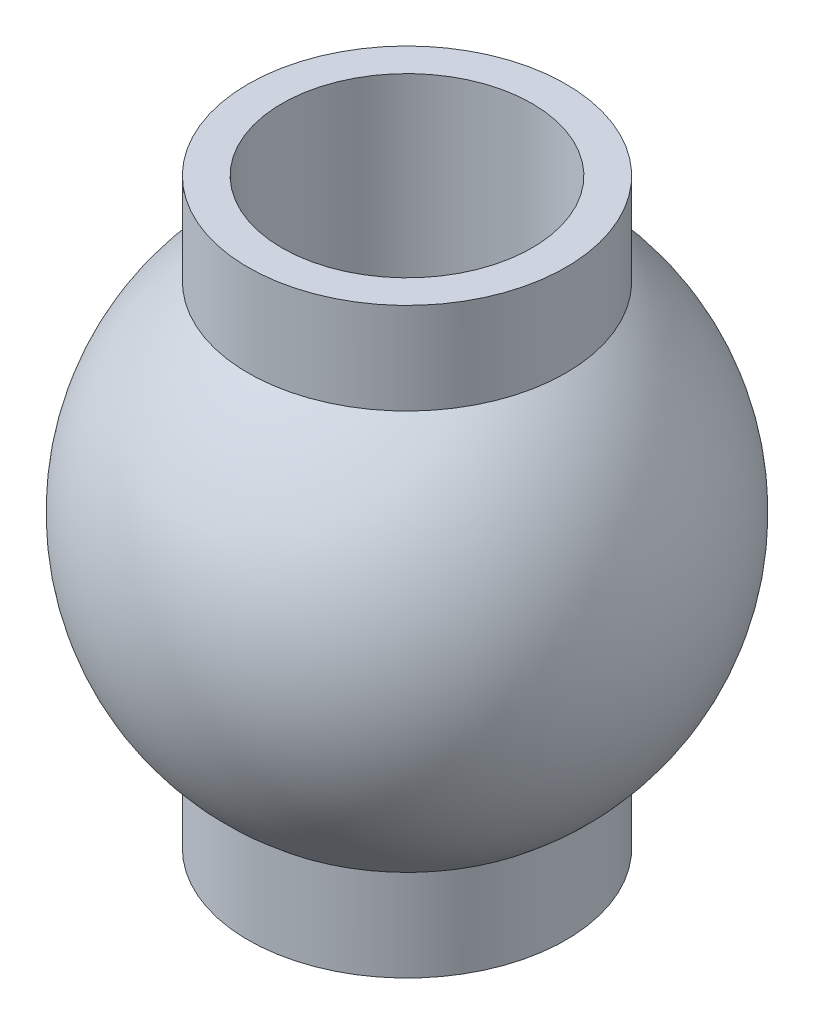
ISO-10303-21;
HEADER;
FILE_DESCRIPTION(('STEP AP214'),'2;1');
FILE_NAME('part.step','',(''),(''),'','','');
FILE_SCHEMA(('AUTOMOTIVE_DESIGN { 1 0 10303 214 1 1 1 1 }'));
ENDSEC;
DATA;
#1=APPLICATION_CONTEXT('core data for automotive mechanical design processes');
#2=APPLICATION_PROTOCOL_DEFINITION('international standard','automotive_design',2000,#1);
#3=PRODUCT_CONTEXT('',#1,'mechanical');
#4=PRODUCT('Part','Part','',(#3));
#5=PRODUCT_RELATED_PRODUCT_CATEGORY('part','',(#4));
#6=PRODUCT_DEFINITION_FORMATION('','',#4);
#7=PRODUCT_DEFINITION_CONTEXT('part definition',#1,'design');
#8=PRODUCT_DEFINITION('design','',#6,#7);
#9=PRODUCT_DEFINITION_SHAPE('','',#8);
#10=(LENGTH_UNIT() NAMED_UNIT(*) SI_UNIT(.MILLI.,.METRE.));
#11=(NAMED_UNIT(*) PLANE_ANGLE_UNIT() SI_UNIT($,.RADIAN.));
#12=(NAMED_UNIT(*) SI_UNIT($,.STERADIAN.) SOLID_ANGLE_UNIT());
#13=UNCERTAINTY_MEASURE_WITH_UNIT(LENGTH_MEASURE(1.E-05),#10,'distance_accuracy_value','');
#14=(GEOMETRIC_REPRESENTATION_CONTEXT(3) GLOBAL_UNCERTAINTY_ASSIGNED_CONTEXT((#13)) GLOBAL_UNIT_ASSIGNED_CONTEXT((#10,
#11,#12)) REPRESENTATION_CONTEXT('',''));
#15=CARTESIAN_POINT('',(0.,0.,0.));
#16=DIRECTION('',(0.,0.,1.));
#17=DIRECTION('',(1.,0.,0.));
#18=AXIS2_PLACEMENT_3D('',#15,#16,#17);
#19=CARTESIAN_POINT('',(0.,-3.4925,0.));
#20=DIRECTION('',(0.,1.,0.));
#21=DIRECTION('',(-1.,0.,0.));
#22=AXIS2_PLACEMENT_3D('',#19,#20,#21);
#23=PLANE('',#22);
#24=CARTESIAN_POINT('',(0.,-3.4925,0.));
#25=DIRECTION('',(0.,1.,0.));
#26=DIRECTION('',(0.,0.,1.));
#27=AXIS2_PLACEMENT_3D('',#24,#25,#26);
#28=CIRCLE('',#27,1.5);
#29=CARTESIAN_POINT('',(0.,-3.4925,1.5));
#30=VERTEX_POINT('',#29);
#31=EDGE_CURVE('E52',#30,#30,#28,.T.);
#32=ORIENTED_EDGE('',*,*,#31,.T.);
#33=EDGE_LOOP('',(#32));
#34=FACE_BOUND('',#33,.T.);
#35=CARTESIAN_POINT('',(0.,-3.4925,0.));
#36=DIRECTION('',(0.,1.,0.));
#37=DIRECTION('',(-1.,0.,0.));
#38=AXIS2_PLACEMENT_3D('',#35,#36,#37);
#39=CIRCLE('',#38,1.905);
#40=CARTESIAN_POINT('',(-1.905,-3.4925,0.));
#41=VERTEX_POINT('',#40);
#42=EDGE_CURVE('E10',#41,#41,#39,.T.);
#43=ORIENTED_EDGE('',*,*,#42,.F.);
#44=EDGE_LOOP('',(#43));
#45=FACE_BOUND('',#44,.T.);
#46=ADVANCED_FACE('F33',(#34,#45),#23,.F.);
#47=CARTESIAN_POINT('',(0.,3.4925,0.));
#48=DIRECTION('',(0.,1.,0.));
#49=DIRECTION('',(-1.,0.,0.));
#50=AXIS2_PLACEMENT_3D('',#47,#48,#49);
#51=CYLINDRICAL_SURFACE('',#50,1.905);
#52=ORIENTED_EDGE('',*,*,#42,.T.);
#53=EDGE_LOOP('',(#52));
#54=FACE_BOUND('',#53,.T.);
#55=CARTESIAN_POINT('',(0.,-2.39559167847945,0.));
#56=DIRECTION('',(0.,1.,0.));
#57=DIRECTION('',(-1.,0.,0.));
#58=AXIS2_PLACEMENT_3D('',#55,#56,#57);
#59=CIRCLE('',#58,1.905);
#60=CARTESIAN_POINT('',(1.905,-2.39559167847945,0.));
#61=VERTEX_POINT('',#60);
#62=EDGE_CURVE('E39',#61,#61,#59,.T.);
#63=ORIENTED_EDGE('',*,*,#62,.F.);
#64=EDGE_LOOP('',(#63));
#65=FACE_BOUND('',#64,.T.);
#66=ADVANCED_FACE('F75',(#54,#65),#51,.T.);
#67=CARTESIAN_POINT('',(0.,0.,0.));
#68=DIRECTION('',(0.,1.,0.));
#69=DIRECTION('',(1.,0.,0.));
#70=AXIS2_PLACEMENT_3D('',#67,#68,#69);
#71=SPHERICAL_SURFACE('',#70,3.0607);
#72=CARTESIAN_POINT('',(0.,2.39559167847945,0.));
#73=DIRECTION('',(0.,1.,0.));
#74=DIRECTION('',(-1.,0.,0.));
#75=AXIS2_PLACEMENT_3D('',#72,#73,#74);
#76=CIRCLE('',#75,1.905);
#77=CARTESIAN_POINT('',(1.905,2.39559167847945,0.));
#78=VERTEX_POINT('',#77);
#79=EDGE_CURVE('E43',#78,#78,#76,.T.);
#80=CARTESIAN_POINT('',(1.905,2.39559167847945,0.));
#81=CARTESIAN_POINT('',(1.9498677774257,2.35991467323254,0.));
#82=CARTESIAN_POINT('',(1.99373086731148,2.32297453014234,0.));
#83=CARTESIAN_POINT('',(2.07931456937734,2.24669053752601,0.));
#84=CARTESIAN_POINT('',(2.12103518155743,2.20734668799988,0.));
#85=CARTESIAN_POINT('',(2.20220082558608,2.1263778517624,0.));
#86=CARTESIAN_POINT('',(2.24164585743465,2.08475286505104,0.));
#87=CARTESIAN_POINT('',(2.31813623192145,1.9993535558919,0.));
#88=CARTESIAN_POINT('',(2.35518157455969,1.95557923344411,0.));
#89=CARTESIAN_POINT('',(2.42675554988551,1.86601929306973,0.));
#90=CARTESIAN_POINT('',(2.46128418257308,1.82023367514313,0.));
#91=CARTESIAN_POINT('',(2.52771579028412,1.72679567782688,0.));
#92=CARTESIAN_POINT('',(2.5596187653076,1.67914329843723,0.));
#93=CARTESIAN_POINT('',(2.62069836191274,1.58212216475763,0.));
#94=CARTESIAN_POINT('',(2.64987498349439,1.53275341046768,0.));
#95=CARTESIAN_POINT('',(2.7054097913733,1.43245534104885,0.));
#96=CARTESIAN_POINT('',(2.73176797767056,1.38152602591997,0.));
#97=CARTESIAN_POINT('',(2.78158272584903,1.27826757133528,0.));
#98=CARTESIAN_POINT('',(2.80503928773024,1.22593843187946,0.));
#99=CARTESIAN_POINT('',(2.84897675638072,1.12004548386588,0.));
#100=CARTESIAN_POINT('',(2.86945766314998,1.0664816753081,0.));
#101=CARTESIAN_POINT('',(2.90737918211313,0.958288440831155,0.));
#102=CARTESIAN_POINT('',(2.92481979430702,0.903659014911986,0.));
#103=CARTESIAN_POINT('',(2.95660568012376,0.79350696068283,0.));
#104=CARTESIAN_POINT('',(2.97095095374661,0.737984332372845,0.));
#105=CARTESIAN_POINT('',(2.99650088755571,0.626221107338337,0.));
#106=CARTESIAN_POINT('',(3.00770554774195,0.569980510613815,0.));
#107=CARTESIAN_POINT('',(3.0269388918499,0.456958848697729,0.));
#108=CARTESIAN_POINT('',(3.0349675757716,0.400177783506166,0.));
#109=CARTESIAN_POINT('',(3.04782362816381,0.286254390365367,0.));
#110=CARTESIAN_POINT('',(3.0526509966343,0.229112062416131,0.));
#111=CARTESIAN_POINT('',(3.0590891825524,0.114646489644597,0.));
#112=CARTESIAN_POINT('',(3.0607,0.0573232448222988,0.));
#113=CARTESIAN_POINT('',(3.0607,-0.0573232448222984,0.));
#114=CARTESIAN_POINT('',(3.0590891825524,-0.114646489644597,0.));
#115=CARTESIAN_POINT('',(3.0526509966343,-0.229112062416131,0.));
#116=CARTESIAN_POINT('',(3.04782362816381,-0.286254390365366,0.));
#117=CARTESIAN_POINT('',(3.0349675757716,-0.400177783506165,0.));
#118=CARTESIAN_POINT('',(3.0269388918499,-0.456958848697729,0.));
#119=CARTESIAN_POINT('',(3.00770554774195,-0.569980510613815,0.));
#120=CARTESIAN_POINT('',(2.99650088755571,-0.626221107338337,0.));
#121=CARTESIAN_POINT('',(2.97095095374661,-0.737984332372845,0.));
#122=CARTESIAN_POINT('',(2.95660568012376,-0.79350696068283,0.));
#123=CARTESIAN_POINT('',(2.92481979430702,-0.903659014911986,0.));
#124=CARTESIAN_POINT('',(2.90737918211313,-0.958288440831155,0.));
#125=CARTESIAN_POINT('',(2.86945766314998,-1.0664816753081,0.));
#126=CARTESIAN_POINT('',(2.84897675638072,-1.12004548386588,0.));
#127=CARTESIAN_POINT('',(2.80503928773024,-1.22593843187946,0.));
#128=CARTESIAN_POINT('',(2.78158272584903,-1.27826757133528,0.));
#129=CARTESIAN_POINT('',(2.73176797767056,-1.38152602591997,0.));
#130=CARTESIAN_POINT('',(2.7054097913733,-1.43245534104885,0.));
#131=CARTESIAN_POINT('',(2.64987498349439,-1.53275341046768,0.));
#132=CARTESIAN_POINT('',(2.62069836191274,-1.58212216475763,0.));
#133=CARTESIAN_POINT('',(2.5596187653076,-1.67914329843723,0.));
#134=CARTESIAN_POINT('',(2.52771579028412,-1.72679567782688,0.));
#135=CARTESIAN_POINT('',(2.46128418257308,-1.82023367514313,0.));
#136=CARTESIAN_POINT('',(2.42675554988551,-1.86601929306973,0.));
#137=CARTESIAN_POINT('',(2.35518157455969,-1.95557923344411,0.));
#138=CARTESIAN_POINT('',(2.31813623192145,-1.9993535558919,0.));
#139=CARTESIAN_POINT('',(2.24164585743465,-2.08475286505104,0.));
#140=CARTESIAN_POINT('',(2.20220082558608,-2.1263778517624,0.));
#141=CARTESIAN_POINT('',(2.12103518155743,-2.20734668799988,0.));
#142=CARTESIAN_POINT('',(2.07931456937734,-2.24669053752601,0.));
#143=CARTESIAN_POINT('',(1.99373086731148,-2.32297453014234,0.));
#144=CARTESIAN_POINT('',(1.9498677774257,-2.35991467323254,0.));
#145=CARTESIAN_POINT('',(1.905,-2.39559167847945,0.));
#146=B_SPLINE_CURVE_WITH_KNOTS('',3,(#80,#81,#82,#83,#84,#85,#86,#87,#88,#89,#90,#91,#92,#93,
#94,#95,#96,#97,#98,#99,#100,#101,#102,#103,#104,#105,#106,#107,#108,#109,#110,#111,#112,#113,
#114,#115,#116,#117,#118,#119,#120,#121,#122,#123,#124,#125,#126,#127,#128,#129,#130,#131,#132,
#133,#134,#135,#136,#137,#138,#139,#140,#141,#142,#143,#144,#145),.UNSPECIFIED.,.F.,.F.,(4,2,2,
2,2,2,2,2,2,2,2,2,2,2,2,2,2,2,2,2,2,2,2,2,2,2,2,2,2,2,2,2,4),(0.,0.171947124323899,
0.343894248647798,0.515841372971697,0.687788497295596,0.859735621619495,1.03168274594339,
1.20362987026729,1.37557699459119,1.54752411891509,1.71947124323899,1.89141836756289,
2.06336549188679,2.23531261621069,2.40725974053458,2.57920686485848,2.75115398918238,
2.92310111350628,3.09504823783018,3.26699536215408,3.43894248647798,3.61088961080188,
3.78283673512578,3.95478385944967,4.12673098377357,4.29867810809747,4.47062523242137,
4.64257235674527,4.81451948106917,4.98646660539307,5.15841372971697,5.33036085404087,
5.50230797836477),.UNSPECIFIED.);
#147=EDGE_CURVE('BSEAM69',#78,#61,#146,.T.);
#148=ORIENTED_EDGE('',*,*,#79,.F.);
#149=ORIENTED_EDGE('',*,*,#62,.T.);
#150=ORIENTED_EDGE('',*,*,#147,.T.);
#151=ORIENTED_EDGE('',*,*,#147,.F.);
#152=EDGE_LOOP('',(#148,#150,#149,#151));
#153=FACE_BOUND('',#152,.T.);
#154=ADVANCED_FACE('F69',(#153),#71,.T.);
#155=CARTESIAN_POINT('',(0.,3.4925,0.));
#156=DIRECTION('',(0.,1.,0.));
#157=DIRECTION('',(-1.,0.,0.));
#158=AXIS2_PLACEMENT_3D('',#155,#156,#157);
#159=CYLINDRICAL_SURFACE('',#158,1.905);
#160=ORIENTED_EDGE('',*,*,#79,.T.);
#161=EDGE_LOOP('',(#160));
#162=FACE_BOUND('',#161,.T.);
#163=CARTESIAN_POINT('',(0.,3.4925,0.));
#164=DIRECTION('',(0.,1.,0.));
#165=DIRECTION('',(-1.,0.,0.));
#166=AXIS2_PLACEMENT_3D('',#163,#164,#165);
#167=CIRCLE('',#166,1.905);
#168=CARTESIAN_POINT('',(-1.905,3.4925,0.));
#169=VERTEX_POINT('',#168);
#170=EDGE_CURVE('E47',#169,#169,#167,.T.);
#171=ORIENTED_EDGE('',*,*,#170,.F.);
#172=EDGE_LOOP('',(#171));
#173=FACE_BOUND('',#172,.T.);
#174=ADVANCED_FACE('F64',(#162,#173),#159,.T.);
#175=CARTESIAN_POINT('',(0.,3.4925,0.));
#176=DIRECTION('',(0.,1.,0.));
#177=DIRECTION('',(-1.,0.,0.));
#178=AXIS2_PLACEMENT_3D('',#175,#176,#177);
#179=PLANE('',#178);
#180=CARTESIAN_POINT('',(0.,3.4925,0.));
#181=DIRECTION('',(0.,1.,0.));
#182=DIRECTION('',(0.,0.,1.));
#183=AXIS2_PLACEMENT_3D('',#180,#181,#182);
#184=CIRCLE('',#183,1.5);
#185=CARTESIAN_POINT('',(0.,3.4925,1.5));
#186=VERTEX_POINT('',#185);
#187=EDGE_CURVE('E55',#186,#186,#184,.T.);
#188=ORIENTED_EDGE('',*,*,#187,.F.);
#189=EDGE_LOOP('',(#188));
#190=FACE_BOUND('',#189,.T.);
#191=ORIENTED_EDGE('',*,*,#170,.T.);
#192=EDGE_LOOP('',(#191));
#193=FACE_BOUND('',#192,.T.);
#194=ADVANCED_FACE('F61',(#190,#193),#179,.T.);
#195=CARTESIAN_POINT('',(0.,-3.4925,0.));
#196=DIRECTION('',(0.,1.,0.));
#197=DIRECTION('',(0.,0.,1.));
#198=AXIS2_PLACEMENT_3D('',#195,#196,#197);
#199=CYLINDRICAL_SURFACE('',#198,1.5);
#200=CARTESIAN_POINT('',(0.,-3.4925,1.5));
#201=CARTESIAN_POINT('',(0.,-3.41973958333333,1.5));
#202=CARTESIAN_POINT('',(0.,-3.34697916666667,1.5));
#203=CARTESIAN_POINT('',(0.,-3.20145833333333,1.5));
#204=CARTESIAN_POINT('',(0.,-3.12869791666667,1.5));
#205=CARTESIAN_POINT('',(0.,-2.98317708333333,1.5));
#206=CARTESIAN_POINT('',(0.,-2.91041666666667,1.5));
#207=CARTESIAN_POINT('',(0.,-2.76489583333333,1.5));
#208=CARTESIAN_POINT('',(0.,-2.69213541666667,1.5));
#209=CARTESIAN_POINT('',(0.,-2.54661458333333,1.5));
#210=CARTESIAN_POINT('',(0.,-2.47385416666667,1.5));
#211=CARTESIAN_POINT('',(0.,-2.32833333333333,1.5));
#212=CARTESIAN_POINT('',(0.,-2.25557291666667,1.5));
#213=CARTESIAN_POINT('',(0.,-2.11005208333333,1.5));
#214=CARTESIAN_POINT('',(0.,-2.03729166666667,1.5));
#215=CARTESIAN_POINT('',(0.,-1.89177083333333,1.5));
#216=CARTESIAN_POINT('',(0.,-1.81901041666667,1.5));
#217=CARTESIAN_POINT('',(0.,-1.67348958333333,1.5));
#218=CARTESIAN_POINT('',(0.,-1.60072916666667,1.5));
#219=CARTESIAN_POINT('',(0.,-1.45520833333333,1.5));
#220=CARTESIAN_POINT('',(0.,-1.38244791666667,1.5));
#221=CARTESIAN_POINT('',(0.,-1.23692708333333,1.5));
#222=CARTESIAN_POINT('',(0.,-1.16416666666667,1.5));
#223=CARTESIAN_POINT('',(0.,-1.01864583333333,1.5));
#224=CARTESIAN_POINT('',(0.,-0.945885416666667,1.5));
#225=CARTESIAN_POINT('',(0.,-0.800364583333334,1.5));
#226=CARTESIAN_POINT('',(0.,-0.727604166666667,1.5));
#227=CARTESIAN_POINT('',(0.,-0.582083333333334,1.5));
#228=CARTESIAN_POINT('',(0.,-0.509322916666667,1.5));
#229=CARTESIAN_POINT('',(0.,-0.363802083333334,1.5));
#230=CARTESIAN_POINT('',(0.,-0.291041666666667,1.5));
#231=CARTESIAN_POINT('',(0.,-0.145520833333334,1.5));
#232=CARTESIAN_POINT('',(0.,-0.0727604166666672,1.5));
#233=CARTESIAN_POINT('',(0.,0.0727604166666663,1.5));
#234=CARTESIAN_POINT('',(0.,0.145520833333333,1.5));
#235=CARTESIAN_POINT('',(0.,0.291041666666666,1.5));
#236=CARTESIAN_POINT('',(0.,0.363802083333333,1.5));
#237=CARTESIAN_POINT('',(0.,0.509322916666667,1.5));
#238=CARTESIAN_POINT('',(0.,0.582083333333333,1.5));
#239=CARTESIAN_POINT('',(0.,0.727604166666666,1.5));
#240=CARTESIAN_POINT('',(0.,0.800364583333333,1.5));
#241=CARTESIAN_POINT('',(0.,0.945885416666666,1.5));
#242=CARTESIAN_POINT('',(0.,1.01864583333333,1.5));
#243=CARTESIAN_POINT('',(0.,1.16416666666667,1.5));
#244=CARTESIAN_POINT('',(0.,1.23692708333333,1.5));
#245=CARTESIAN_POINT('',(0.,1.38244791666667,1.5));
#246=CARTESIAN_POINT('',(0.,1.45520833333333,1.5));
#247=CARTESIAN_POINT('',(0.,1.60072916666667,1.5));
#248=CARTESIAN_POINT('',(0.,1.67348958333333,1.5));
#249=CARTESIAN_POINT('',(0.,1.81901041666667,1.5));
#250=CARTESIAN_POINT('',(0.,1.89177083333333,1.5));
#251=CARTESIAN_POINT('',(0.,2.03729166666667,1.5));
#252=CARTESIAN_POINT('',(0.,2.11005208333333,1.5));
#253=CARTESIAN_POINT('',(0.,2.25557291666667,1.5));
#254=CARTESIAN_POINT('',(0.,2.32833333333333,1.5));
#255=CARTESIAN_POINT('',(0.,2.47385416666667,1.5));
#256=CARTESIAN_POINT('',(0.,2.54661458333333,1.5));
#257=CARTESIAN_POINT('',(0.,2.69213541666667,1.5));
#258=CARTESIAN_POINT('',(0.,2.76489583333333,1.5));
#259=CARTESIAN_POINT('',(0.,2.91041666666667,1.5));
#260=CARTESIAN_POINT('',(0.,2.98317708333333,1.5));
#261=CARTESIAN_POINT('',(0.,3.12869791666667,1.5));
#262=CARTESIAN_POINT('',(0.,3.20145833333333,1.5));
#263=CARTESIAN_POINT('',(0.,3.34697916666667,1.5));
#264=CARTESIAN_POINT('',(0.,3.41973958333333,1.5));
#265=CARTESIAN_POINT('',(0.,3.4925,1.5));
#266=B_SPLINE_CURVE_WITH_KNOTS('',3,(#200,#201,#202,#203,#204,#205,#206,#207,#208,#209,#210,
#211,#212,#213,#214,#215,#216,#217,#218,#219,#220,#221,#222,#223,#224,#225,#226,#227,#228,#229,
#230,#231,#232,#233,#234,#235,#236,#237,#238,#239,#240,#241,#242,#243,#244,#245,#246,#247,#248,
#249,#250,#251,#252,#253,#254,#255,#256,#257,#258,#259,#260,#261,#262,#263,#264,#265),
.UNSPECIFIED.,.F.,.F.,(4,2,2,2,2,2,2,2,2,2,2,2,2,2,2,2,2,2,2,2,2,2,2,2,2,2,2,2,2,2,2,2,4),(0.,
0.21828125,0.4365625,0.65484375,0.873125,1.09140625,1.3096875,1.52796875,1.74625,1.96453125,
2.1828125,2.40109375,2.619375,2.83765625,3.0559375,3.27421875,3.4925,3.71078125,3.9290625,
4.14734375,4.365625,4.58390625,4.8021875,5.02046875,5.23875,5.45703125,5.6753125,5.89359375,
6.111875,6.33015625,6.5484375,6.76671875,6.985),.UNSPECIFIED.);
#267=EDGE_CURVE('BSEAM59',#30,#186,#266,.T.);
#268=ORIENTED_EDGE('',*,*,#31,.F.);
#269=ORIENTED_EDGE('',*,*,#187,.T.);
#270=ORIENTED_EDGE('',*,*,#267,.T.);
#271=ORIENTED_EDGE('',*,*,#267,.F.);
#272=EDGE_LOOP('',(#268,#270,#269,#271));
#273=FACE_BOUND('',#272,.T.);
#274=ADVANCED_FACE('F59',(#273),#199,.F.);
#275=CLOSED_SHELL('',(#46,#66,#154,#174,#194,#274));
#276=MANIFOLD_SOLID_BREP('B2',#275);
#277=ADVANCED_BREP_SHAPE_REPRESENTATION('',(#18,#276),#14);
#278=SHAPE_DEFINITION_REPRESENTATION(#9,#277);
ENDSEC;
END-ISO-10303-21;
